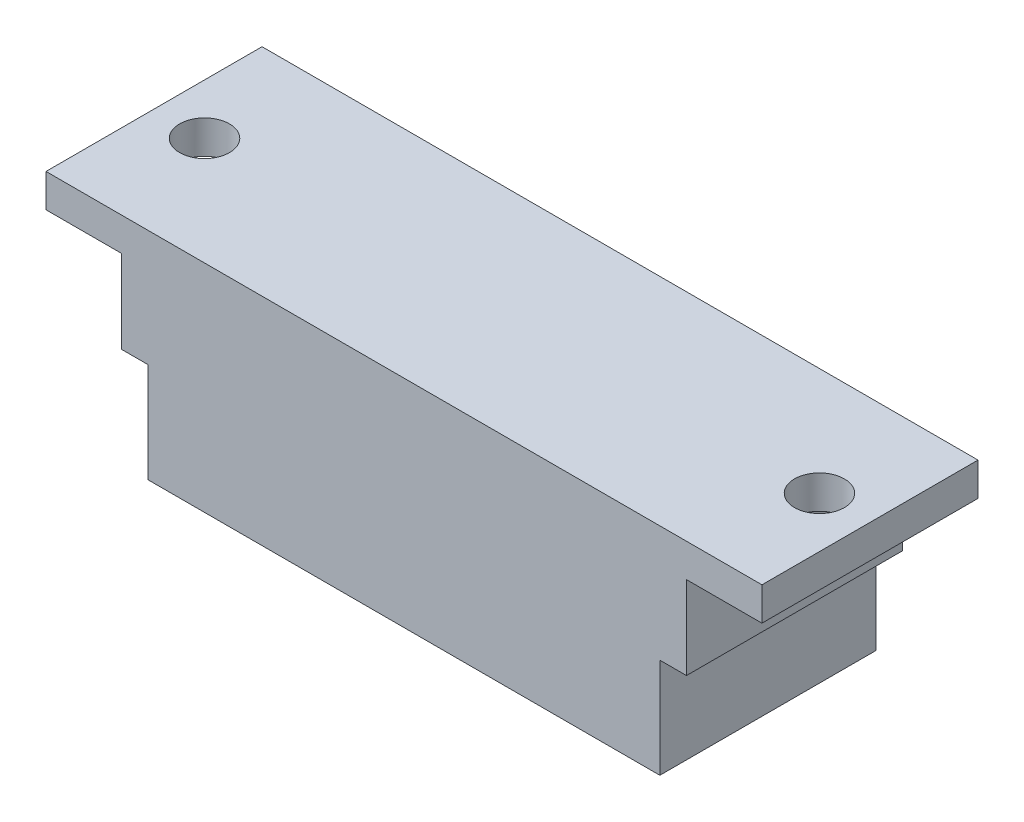
ISO-10303-21;
HEADER;
FILE_DESCRIPTION(('STEP AP214'),'2;1');
FILE_NAME('part.step','',(''),(''),'','','');
FILE_SCHEMA(('AUTOMOTIVE_DESIGN { 1 0 10303 214 1 1 1 1 }'));
ENDSEC;
DATA;
#1=APPLICATION_CONTEXT('core data for automotive mechanical design processes');
#2=APPLICATION_PROTOCOL_DEFINITION('international standard','automotive_design',2000,#1);
#3=PRODUCT_CONTEXT('',#1,'mechanical');
#4=PRODUCT('Part','Part','',(#3));
#5=PRODUCT_RELATED_PRODUCT_CATEGORY('part','',(#4));
#6=PRODUCT_DEFINITION_FORMATION('','',#4);
#7=PRODUCT_DEFINITION_CONTEXT('part definition',#1,'design');
#8=PRODUCT_DEFINITION('design','',#6,#7);
#9=PRODUCT_DEFINITION_SHAPE('','',#8);
#10=(LENGTH_UNIT() NAMED_UNIT(*) SI_UNIT(.MILLI.,.METRE.));
#11=(NAMED_UNIT(*) PLANE_ANGLE_UNIT() SI_UNIT($,.RADIAN.));
#12=(NAMED_UNIT(*) SI_UNIT($,.STERADIAN.) SOLID_ANGLE_UNIT());
#13=UNCERTAINTY_MEASURE_WITH_UNIT(LENGTH_MEASURE(1.E-05),#10,'distance_accuracy_value','');
#14=(GEOMETRIC_REPRESENTATION_CONTEXT(3) GLOBAL_UNCERTAINTY_ASSIGNED_CONTEXT((#13)) GLOBAL_UNIT_ASSIGNED_CONTEXT((#10,
#11,#12)) REPRESENTATION_CONTEXT('',''));
#15=CARTESIAN_POINT('',(0.,0.,0.));
#16=DIRECTION('',(0.,0.,1.));
#17=DIRECTION('',(1.,0.,0.));
#18=AXIS2_PLACEMENT_3D('',#15,#16,#17);
#19=CARTESIAN_POINT('',(21.5406738491967,5.29196437602219,13.));
#20=DIRECTION('',(-1.,0.,0.));
#21=DIRECTION('',(0.,0.,1.));
#22=AXIS2_PLACEMENT_3D('',#19,#20,#21);
#23=PLANE('',#22);
#24=DIRECTION('',(0.,1.,0.));
#25=VECTOR('',#24,1.);
#26=CARTESIAN_POINT('',(21.5406738491967,5.29196437602219,0.));
#27=LINE('',#26,#25);
#28=CARTESIAN_POINT('',(21.5406738491967,3.2919643760222,0.));
#29=VERTEX_POINT('',#28);
#30=CARTESIAN_POINT('',(21.5406738491967,5.29196437602219,0.));
#31=VERTEX_POINT('',#30);
#32=EDGE_CURVE('E156',#29,#31,#27,.T.);
#33=ORIENTED_EDGE('',*,*,#32,.T.);
#34=DIRECTION('',(0.,0.,-1.));
#35=VECTOR('',#34,1.);
#36=CARTESIAN_POINT('',(21.5406738491967,5.29196437602219,13.));
#37=LINE('',#36,#35);
#38=CARTESIAN_POINT('',(21.5406738491967,5.29196437602219,13.));
#39=VERTEX_POINT('',#38);
#40=EDGE_CURVE('E11',#39,#31,#37,.T.);
#41=ORIENTED_EDGE('',*,*,#40,.F.);
#42=DIRECTION('',(0.,1.,0.));
#43=VECTOR('',#42,1.);
#44=CARTESIAN_POINT('',(21.5406738491967,5.29196437602219,13.));
#45=LINE('',#44,#43);
#46=CARTESIAN_POINT('',(21.5406738491967,3.2919643760222,13.));
#47=VERTEX_POINT('',#46);
#48=EDGE_CURVE('E179',#47,#39,#45,.T.);
#49=ORIENTED_EDGE('',*,*,#48,.F.);
#50=DIRECTION('',(0.,0.,-1.));
#51=VECTOR('',#50,1.);
#52=CARTESIAN_POINT('',(21.5406738491967,3.2919643760222,13.));
#53=LINE('',#52,#51);
#54=EDGE_CURVE('E152',#47,#29,#53,.T.);
#55=ORIENTED_EDGE('',*,*,#54,.T.);
#56=EDGE_LOOP('',(#33,#41,#49,#55));
#57=FACE_BOUND('',#56,.T.);
#58=ADVANCED_FACE('F34',(#57),#23,.F.);
#59=CARTESIAN_POINT('',(-21.5406738491967,5.29196437602219,13.));
#60=DIRECTION('',(0.,-1.,0.));
#61=DIRECTION('',(0.,0.,-1.));
#62=AXIS2_PLACEMENT_3D('',#59,#60,#61);
#63=PLANE('',#62);
#64=CARTESIAN_POINT('',(18.5,5.29196437602219,6.5));
#65=DIRECTION('',(0.,1.,0.));
#66=DIRECTION('',(0.,0.,-1.));
#67=AXIS2_PLACEMENT_3D('',#64,#65,#66);
#68=CIRCLE('',#67,1.5);
#69=CARTESIAN_POINT('',(18.5,5.29196437602219,5.));
#70=VERTEX_POINT('',#69);
#71=EDGE_CURVE('E211',#70,#70,#68,.T.);
#72=ORIENTED_EDGE('',*,*,#71,.F.);
#73=EDGE_LOOP('',(#72));
#74=FACE_BOUND('',#73,.T.);
#75=CARTESIAN_POINT('',(-18.5,5.29196437602219,6.5));
#76=DIRECTION('',(0.,1.,0.));
#77=DIRECTION('',(0.,0.,1.));
#78=AXIS2_PLACEMENT_3D('',#75,#76,#77);
#79=CIRCLE('',#78,1.5);
#80=CARTESIAN_POINT('',(-18.5,5.29196437602219,8.));
#81=VERTEX_POINT('',#80);
#82=EDGE_CURVE('E203',#81,#81,#79,.T.);
#83=ORIENTED_EDGE('',*,*,#82,.F.);
#84=EDGE_LOOP('',(#83));
#85=FACE_BOUND('',#84,.T.);
#86=DIRECTION('',(-1.,0.,0.));
#87=VECTOR('',#86,1.);
#88=CARTESIAN_POINT('',(-21.5406738491967,5.29196437602219,0.));
#89=LINE('',#88,#87);
#90=CARTESIAN_POINT('',(-21.5406738491967,5.29196437602219,0.));
#91=VERTEX_POINT('',#90);
#92=EDGE_CURVE('E159',#31,#91,#89,.T.);
#93=ORIENTED_EDGE('',*,*,#92,.T.);
#94=DIRECTION('',(0.,0.,-1.));
#95=VECTOR('',#94,1.);
#96=CARTESIAN_POINT('',(-21.5406738491967,5.29196437602219,13.));
#97=LINE('',#96,#95);
#98=CARTESIAN_POINT('',(-21.5406738491967,5.29196437602219,13.));
#99=VERTEX_POINT('',#98);
#100=EDGE_CURVE('E43',#99,#91,#97,.T.);
#101=ORIENTED_EDGE('',*,*,#100,.F.);
#102=DIRECTION('',(-1.,0.,0.));
#103=VECTOR('',#102,1.);
#104=CARTESIAN_POINT('',(-21.5406738491967,5.29196437602219,13.));
#105=LINE('',#104,#103);
#106=EDGE_CURVE('E107',#39,#99,#105,.T.);
#107=ORIENTED_EDGE('',*,*,#106,.F.);
#108=ORIENTED_EDGE('',*,*,#40,.T.);
#109=EDGE_LOOP('',(#93,#101,#107,#108));
#110=FACE_BOUND('',#109,.T.);
#111=ADVANCED_FACE('F256',(#74,#85,#110),#63,.F.);
#112=CARTESIAN_POINT('',(-21.5406738491967,5.29196437602219,13.));
#113=DIRECTION('',(1.,0.,0.));
#114=DIRECTION('',(0.,0.,-1.));
#115=AXIS2_PLACEMENT_3D('',#112,#113,#114);
#116=PLANE('',#115);
#117=DIRECTION('',(0.,-1.,0.));
#118=VECTOR('',#117,1.);
#119=CARTESIAN_POINT('',(-21.5406738491967,5.29196437602219,0.));
#120=LINE('',#119,#118);
#121=CARTESIAN_POINT('',(-21.5406738491967,3.2919643760222,0.));
#122=VERTEX_POINT('',#121);
#123=EDGE_CURVE('E162',#91,#122,#120,.T.);
#124=ORIENTED_EDGE('',*,*,#123,.T.);
#125=DIRECTION('',(0.,0.,-1.));
#126=VECTOR('',#125,1.);
#127=CARTESIAN_POINT('',(-21.5406738491967,3.2919643760222,13.));
#128=LINE('',#127,#126);
#129=CARTESIAN_POINT('',(-21.5406738491967,3.2919643760222,13.));
#130=VERTEX_POINT('',#129);
#131=EDGE_CURVE('E198',#130,#122,#128,.T.);
#132=ORIENTED_EDGE('',*,*,#131,.F.);
#133=DIRECTION('',(0.,-1.,0.));
#134=VECTOR('',#133,1.);
#135=CARTESIAN_POINT('',(-21.5406738491967,5.29196437602219,13.));
#136=LINE('',#135,#134);
#137=EDGE_CURVE('E216',#99,#130,#136,.T.);
#138=ORIENTED_EDGE('',*,*,#137,.F.);
#139=ORIENTED_EDGE('',*,*,#100,.T.);
#140=EDGE_LOOP('',(#124,#132,#138,#139));
#141=FACE_BOUND('',#140,.T.);
#142=ADVANCED_FACE('F260',(#141),#116,.F.);
#143=CARTESIAN_POINT('',(-21.5406738491967,3.2919643760222,13.));
#144=DIRECTION('',(0.,1.,0.));
#145=DIRECTION('',(-1.,0.,0.));
#146=AXIS2_PLACEMENT_3D('',#143,#144,#145);
#147=PLANE('',#146);
#148=CARTESIAN_POINT('',(-18.5,3.2919643760222,6.5));
#149=DIRECTION('',(0.,1.,0.));
#150=DIRECTION('',(-1.,0.,0.));
#151=AXIS2_PLACEMENT_3D('',#148,#149,#150);
#152=CIRCLE('',#151,1.5);
#153=CARTESIAN_POINT('',(-20.,3.2919643760222,6.5));
#154=VERTEX_POINT('',#153);
#155=EDGE_CURVE('E160',#154,#154,#152,.T.);
#156=ORIENTED_EDGE('',*,*,#155,.T.);
#157=EDGE_LOOP('',(#156));
#158=FACE_BOUND('',#157,.T.);
#159=DIRECTION('',(1.,0.,0.));
#160=VECTOR('',#159,1.);
#161=CARTESIAN_POINT('',(-21.5406738491967,3.2919643760222,0.));
#162=LINE('',#161,#160);
#163=CARTESIAN_POINT('',(-16.9995779587858,3.2919643760222,0.));
#164=VERTEX_POINT('',#163);
#165=EDGE_CURVE('E164',#122,#164,#162,.T.);
#166=ORIENTED_EDGE('',*,*,#165,.T.);
#167=DIRECTION('',(0.,0.,-1.));
#168=VECTOR('',#167,1.);
#169=CARTESIAN_POINT('',(-16.9995779587858,3.2919643760222,13.));
#170=LINE('',#169,#168);
#171=CARTESIAN_POINT('',(-16.9995779587858,3.2919643760222,13.));
#172=VERTEX_POINT('',#171);
#173=EDGE_CURVE('E195',#172,#164,#170,.T.);
#174=ORIENTED_EDGE('',*,*,#173,.F.);
#175=DIRECTION('',(1.,0.,0.));
#176=VECTOR('',#175,1.);
#177=CARTESIAN_POINT('',(-21.5406738491967,3.2919643760222,13.));
#178=LINE('',#177,#176);
#179=EDGE_CURVE('E218',#130,#172,#178,.T.);
#180=ORIENTED_EDGE('',*,*,#179,.F.);
#181=ORIENTED_EDGE('',*,*,#131,.T.);
#182=EDGE_LOOP('',(#166,#174,#180,#181));
#183=FACE_BOUND('',#182,.T.);
#184=ADVANCED_FACE('F265',(#158,#183),#147,.F.);
#185=CARTESIAN_POINT('',(-16.9995779587858,3.2919643760222,13.));
#186=DIRECTION('',(1.,0.,0.));
#187=DIRECTION('',(0.,0.,-1.));
#188=AXIS2_PLACEMENT_3D('',#185,#186,#187);
#189=PLANE('',#188);
#190=DIRECTION('',(0.,-1.,0.));
#191=VECTOR('',#190,1.);
#192=CARTESIAN_POINT('',(-16.9995779587858,3.2919643760222,0.));
#193=LINE('',#192,#191);
#194=CARTESIAN_POINT('',(-16.9995779587858,-1.7080356239778,0.));
#195=VERTEX_POINT('',#194);
#196=EDGE_CURVE('E166',#164,#195,#193,.T.);
#197=ORIENTED_EDGE('',*,*,#196,.T.);
#198=DIRECTION('',(0.,0.,-1.));
#199=VECTOR('',#198,1.);
#200=CARTESIAN_POINT('',(-16.9995779587858,-1.7080356239778,13.));
#201=LINE('',#200,#199);
#202=CARTESIAN_POINT('',(-16.9995779587858,-1.7080356239778,13.));
#203=VERTEX_POINT('',#202);
#204=EDGE_CURVE('E192',#203,#195,#201,.T.);
#205=ORIENTED_EDGE('',*,*,#204,.F.);
#206=DIRECTION('',(0.,-1.,0.));
#207=VECTOR('',#206,1.);
#208=CARTESIAN_POINT('',(-16.9995779587858,3.2919643760222,13.));
#209=LINE('',#208,#207);
#210=EDGE_CURVE('E220',#172,#203,#209,.T.);
#211=ORIENTED_EDGE('',*,*,#210,.F.);
#212=ORIENTED_EDGE('',*,*,#173,.T.);
#213=EDGE_LOOP('',(#197,#205,#211,#212));
#214=FACE_BOUND('',#213,.T.);
#215=ADVANCED_FACE('F273',(#214),#189,.F.);
#216=CARTESIAN_POINT('',(-16.9995779587858,-1.7080356239778,13.));
#217=DIRECTION('',(0.,1.,0.));
#218=DIRECTION('',(-1.,0.,0.));
#219=AXIS2_PLACEMENT_3D('',#216,#217,#218);
#220=PLANE('',#219);
#221=DIRECTION('',(1.,0.,0.));
#222=VECTOR('',#221,1.);
#223=CARTESIAN_POINT('',(-16.9995779587858,-1.7080356239778,0.));
#224=LINE('',#223,#222);
#225=CARTESIAN_POINT('',(-15.3968382327583,-1.7080356239778,0.));
#226=VERTEX_POINT('',#225);
#227=EDGE_CURVE('E168',#195,#226,#224,.T.);
#228=ORIENTED_EDGE('',*,*,#227,.T.);
#229=DIRECTION('',(0.,0.,-1.));
#230=VECTOR('',#229,1.);
#231=CARTESIAN_POINT('',(-15.3968382327583,-1.7080356239778,13.));
#232=LINE('',#231,#230);
#233=CARTESIAN_POINT('',(-15.3968382327583,-1.7080356239778,13.));
#234=VERTEX_POINT('',#233);
#235=EDGE_CURVE('E189',#234,#226,#232,.T.);
#236=ORIENTED_EDGE('',*,*,#235,.F.);
#237=DIRECTION('',(1.,0.,0.));
#238=VECTOR('',#237,1.);
#239=CARTESIAN_POINT('',(-16.9995779587858,-1.7080356239778,13.));
#240=LINE('',#239,#238);
#241=EDGE_CURVE('E222',#203,#234,#240,.T.);
#242=ORIENTED_EDGE('',*,*,#241,.F.);
#243=ORIENTED_EDGE('',*,*,#204,.T.);
#244=EDGE_LOOP('',(#228,#236,#242,#243));
#245=FACE_BOUND('',#244,.T.);
#246=ADVANCED_FACE('F276',(#245),#220,.F.);
#247=CARTESIAN_POINT('',(-15.3968382327583,-1.7080356239778,13.));
#248=DIRECTION('',(1.,0.,0.));
#249=DIRECTION('',(0.,0.,-1.));
#250=AXIS2_PLACEMENT_3D('',#247,#248,#249);
#251=PLANE('',#250);
#252=DIRECTION('',(0.,-1.,0.));
#253=VECTOR('',#252,1.);
#254=CARTESIAN_POINT('',(-15.3968382327583,-1.7080356239778,0.));
#255=LINE('',#254,#253);
#256=CARTESIAN_POINT('',(-15.3968382327583,-7.70803562397781,0.));
#257=VERTEX_POINT('',#256);
#258=EDGE_CURVE('E170',#226,#257,#255,.T.);
#259=ORIENTED_EDGE('',*,*,#258,.T.);
#260=DIRECTION('',(0.,0.,-1.));
#261=VECTOR('',#260,1.);
#262=CARTESIAN_POINT('',(-15.3968382327583,-7.70803562397781,13.));
#263=LINE('',#262,#261);
#264=CARTESIAN_POINT('',(-15.3968382327583,-7.70803562397781,13.));
#265=VERTEX_POINT('',#264);
#266=EDGE_CURVE('E186',#265,#257,#263,.T.);
#267=ORIENTED_EDGE('',*,*,#266,.F.);
#268=DIRECTION('',(0.,-1.,0.));
#269=VECTOR('',#268,1.);
#270=CARTESIAN_POINT('',(-15.3968382327583,-1.7080356239778,13.));
#271=LINE('',#270,#269);
#272=EDGE_CURVE('E224',#234,#265,#271,.T.);
#273=ORIENTED_EDGE('',*,*,#272,.F.);
#274=ORIENTED_EDGE('',*,*,#235,.T.);
#275=EDGE_LOOP('',(#259,#267,#273,#274));
#276=FACE_BOUND('',#275,.T.);
#277=ADVANCED_FACE('F280',(#276),#251,.F.);
#278=CARTESIAN_POINT('',(15.3968382327583,-7.70803562397781,13.));
#279=DIRECTION('',(0.,1.,0.));
#280=DIRECTION('',(0.,0.,1.));
#281=AXIS2_PLACEMENT_3D('',#278,#279,#280);
#282=PLANE('',#281);
#283=DIRECTION('',(1.,0.,0.));
#284=VECTOR('',#283,1.);
#285=CARTESIAN_POINT('',(15.3968382327583,-7.70803562397781,0.));
#286=LINE('',#285,#284);
#287=CARTESIAN_POINT('',(15.3968382327583,-7.70803562397781,0.));
#288=VERTEX_POINT('',#287);
#289=EDGE_CURVE('E172',#257,#288,#286,.T.);
#290=ORIENTED_EDGE('',*,*,#289,.T.);
#291=DIRECTION('',(0.,0.,-1.));
#292=VECTOR('',#291,1.);
#293=CARTESIAN_POINT('',(15.3968382327583,-7.70803562397781,13.));
#294=LINE('',#293,#292);
#295=CARTESIAN_POINT('',(15.3968382327583,-7.70803562397781,13.));
#296=VERTEX_POINT('',#295);
#297=EDGE_CURVE('E183',#296,#288,#294,.T.);
#298=ORIENTED_EDGE('',*,*,#297,.F.);
#299=DIRECTION('',(1.,0.,0.));
#300=VECTOR('',#299,1.);
#301=CARTESIAN_POINT('',(15.3968382327583,-7.70803562397781,13.));
#302=LINE('',#301,#300);
#303=EDGE_CURVE('E226',#265,#296,#302,.T.);
#304=ORIENTED_EDGE('',*,*,#303,.F.);
#305=ORIENTED_EDGE('',*,*,#266,.T.);
#306=EDGE_LOOP('',(#290,#298,#304,#305));
#307=FACE_BOUND('',#306,.T.);
#308=ADVANCED_FACE('F232',(#307),#282,.F.);
#309=CARTESIAN_POINT('',(15.3968382327583,-1.7080356239778,13.));
#310=DIRECTION('',(-1.,0.,0.));
#311=DIRECTION('',(0.,0.,1.));
#312=AXIS2_PLACEMENT_3D('',#309,#310,#311);
#313=PLANE('',#312);
#314=DIRECTION('',(0.,1.,0.));
#315=VECTOR('',#314,1.);
#316=CARTESIAN_POINT('',(15.3968382327583,-1.7080356239778,0.));
#317=LINE('',#316,#315);
#318=CARTESIAN_POINT('',(15.3968382327583,-1.7080356239778,0.));
#319=VERTEX_POINT('',#318);
#320=EDGE_CURVE('E174',#288,#319,#317,.T.);
#321=ORIENTED_EDGE('',*,*,#320,.T.);
#322=DIRECTION('',(0.,0.,-1.));
#323=VECTOR('',#322,1.);
#324=CARTESIAN_POINT('',(15.3968382327583,-1.7080356239778,13.));
#325=LINE('',#324,#323);
#326=CARTESIAN_POINT('',(15.3968382327583,-1.7080356239778,13.));
#327=VERTEX_POINT('',#326);
#328=EDGE_CURVE('E147',#327,#319,#325,.T.);
#329=ORIENTED_EDGE('',*,*,#328,.F.);
#330=DIRECTION('',(0.,1.,0.));
#331=VECTOR('',#330,1.);
#332=CARTESIAN_POINT('',(15.3968382327583,-1.7080356239778,13.));
#333=LINE('',#332,#331);
#334=EDGE_CURVE('E138',#296,#327,#333,.T.);
#335=ORIENTED_EDGE('',*,*,#334,.F.);
#336=ORIENTED_EDGE('',*,*,#297,.T.);
#337=EDGE_LOOP('',(#321,#329,#335,#336));
#338=FACE_BOUND('',#337,.T.);
#339=ADVANCED_FACE('F236',(#338),#313,.F.);
#340=CARTESIAN_POINT('',(16.9995779587858,-1.7080356239778,13.));
#341=DIRECTION('',(0.,1.,0.));
#342=DIRECTION('',(-1.,0.,0.));
#343=AXIS2_PLACEMENT_3D('',#340,#341,#342);
#344=PLANE('',#343);
#345=DIRECTION('',(1.,0.,0.));
#346=VECTOR('',#345,1.);
#347=CARTESIAN_POINT('',(16.9995779587858,-1.7080356239778,0.));
#348=LINE('',#347,#346);
#349=CARTESIAN_POINT('',(16.9995779587858,-1.7080356239778,0.));
#350=VERTEX_POINT('',#349);
#351=EDGE_CURVE('E146',#319,#350,#348,.T.);
#352=ORIENTED_EDGE('',*,*,#351,.T.);
#353=DIRECTION('',(0.,0.,-1.));
#354=VECTOR('',#353,1.);
#355=CARTESIAN_POINT('',(16.9995779587858,-1.7080356239778,13.));
#356=LINE('',#355,#354);
#357=CARTESIAN_POINT('',(16.9995779587858,-1.7080356239778,13.));
#358=VERTEX_POINT('',#357);
#359=EDGE_CURVE('E143',#358,#350,#356,.T.);
#360=ORIENTED_EDGE('',*,*,#359,.F.);
#361=DIRECTION('',(1.,0.,0.));
#362=VECTOR('',#361,1.);
#363=CARTESIAN_POINT('',(16.9995779587858,-1.7080356239778,13.));
#364=LINE('',#363,#362);
#365=EDGE_CURVE('E132',#327,#358,#364,.T.);
#366=ORIENTED_EDGE('',*,*,#365,.F.);
#367=ORIENTED_EDGE('',*,*,#328,.T.);
#368=EDGE_LOOP('',(#352,#360,#366,#367));
#369=FACE_BOUND('',#368,.T.);
#370=ADVANCED_FACE('F144',(#369),#344,.F.);
#371=CARTESIAN_POINT('',(16.9995779587858,3.2919643760222,13.));
#372=DIRECTION('',(-1.,0.,0.));
#373=DIRECTION('',(0.,0.,1.));
#374=AXIS2_PLACEMENT_3D('',#371,#372,#373);
#375=PLANE('',#374);
#376=DIRECTION('',(0.,1.,0.));
#377=VECTOR('',#376,1.);
#378=CARTESIAN_POINT('',(16.9995779587858,3.2919643760222,0.));
#379=LINE('',#378,#377);
#380=CARTESIAN_POINT('',(16.9995779587858,3.2919643760222,0.));
#381=VERTEX_POINT('',#380);
#382=EDGE_CURVE('E93',#350,#381,#379,.T.);
#383=ORIENTED_EDGE('',*,*,#382,.T.);
#384=DIRECTION('',(0.,0.,-1.));
#385=VECTOR('',#384,1.);
#386=CARTESIAN_POINT('',(16.9995779587858,3.2919643760222,13.));
#387=LINE('',#386,#385);
#388=CARTESIAN_POINT('',(16.9995779587858,3.2919643760222,13.));
#389=VERTEX_POINT('',#388);
#390=EDGE_CURVE('E148',#389,#381,#387,.T.);
#391=ORIENTED_EDGE('',*,*,#390,.F.);
#392=DIRECTION('',(0.,1.,0.));
#393=VECTOR('',#392,1.);
#394=CARTESIAN_POINT('',(16.9995779587858,3.2919643760222,13.));
#395=LINE('',#394,#393);
#396=EDGE_CURVE('E136',#358,#389,#395,.T.);
#397=ORIENTED_EDGE('',*,*,#396,.F.);
#398=ORIENTED_EDGE('',*,*,#359,.T.);
#399=EDGE_LOOP('',(#383,#391,#397,#398));
#400=FACE_BOUND('',#399,.T.);
#401=ADVANCED_FACE('F150',(#400),#375,.F.);
#402=CARTESIAN_POINT('',(21.5406738491967,3.2919643760222,13.));
#403=DIRECTION('',(0.,1.,0.));
#404=DIRECTION('',(-1.,0.,0.));
#405=AXIS2_PLACEMENT_3D('',#402,#403,#404);
#406=PLANE('',#405);
#407=CARTESIAN_POINT('',(18.5,3.2919643760222,6.5));
#408=DIRECTION('',(0.,1.,0.));
#409=DIRECTION('',(-1.,0.,0.));
#410=AXIS2_PLACEMENT_3D('',#407,#408,#409);
#411=CIRCLE('',#410,1.5);
#412=CARTESIAN_POINT('',(17.,3.2919643760222,6.5));
#413=VERTEX_POINT('',#412);
#414=EDGE_CURVE('E37',#413,#413,#411,.T.);
#415=ORIENTED_EDGE('',*,*,#414,.T.);
#416=EDGE_LOOP('',(#415));
#417=FACE_BOUND('',#416,.T.);
#418=DIRECTION('',(1.,0.,0.));
#419=VECTOR('',#418,1.);
#420=CARTESIAN_POINT('',(21.5406738491967,3.2919643760222,0.));
#421=LINE('',#420,#419);
#422=EDGE_CURVE('E99',#381,#29,#421,.T.);
#423=ORIENTED_EDGE('',*,*,#422,.T.);
#424=ORIENTED_EDGE('',*,*,#54,.F.);
#425=DIRECTION('',(1.,0.,0.));
#426=VECTOR('',#425,1.);
#427=CARTESIAN_POINT('',(21.5406738491967,3.2919643760222,13.));
#428=LINE('',#427,#426);
#429=EDGE_CURVE('E52',#389,#47,#428,.T.);
#430=ORIENTED_EDGE('',*,*,#429,.F.);
#431=ORIENTED_EDGE('',*,*,#390,.T.);
#432=EDGE_LOOP('',(#423,#424,#430,#431));
#433=FACE_BOUND('',#432,.T.);
#434=ADVANCED_FACE('F244',(#417,#433),#406,.F.);
#435=CARTESIAN_POINT('',(0.,0.,13.));
#436=DIRECTION('',(0.,0.,-1.));
#437=DIRECTION('',(-1.,0.,0.));
#438=AXIS2_PLACEMENT_3D('',#435,#436,#437);
#439=PLANE('',#438);
#440=ORIENTED_EDGE('',*,*,#48,.T.);
#441=ORIENTED_EDGE('',*,*,#106,.T.);
#442=ORIENTED_EDGE('',*,*,#137,.T.);
#443=ORIENTED_EDGE('',*,*,#179,.T.);
#444=ORIENTED_EDGE('',*,*,#210,.T.);
#445=ORIENTED_EDGE('',*,*,#241,.T.);
#446=ORIENTED_EDGE('',*,*,#272,.T.);
#447=ORIENTED_EDGE('',*,*,#303,.T.);
#448=ORIENTED_EDGE('',*,*,#334,.T.);
#449=ORIENTED_EDGE('',*,*,#365,.T.);
#450=ORIENTED_EDGE('',*,*,#396,.T.);
#451=ORIENTED_EDGE('',*,*,#429,.T.);
#452=EDGE_LOOP('',(#440,#441,#442,#443,#444,#445,#446,#447,#448,#449,#450,#451));
#453=FACE_BOUND('',#452,.T.);
#454=ADVANCED_FACE('F134',(#453),#439,.F.);
#455=CARTESIAN_POINT('',(0.,0.,0.));
#456=DIRECTION('',(0.,0.,-1.));
#457=DIRECTION('',(-1.,0.,0.));
#458=AXIS2_PLACEMENT_3D('',#455,#456,#457);
#459=PLANE('',#458);
#460=ORIENTED_EDGE('',*,*,#32,.F.);
#461=ORIENTED_EDGE('',*,*,#422,.F.);
#462=ORIENTED_EDGE('',*,*,#382,.F.);
#463=ORIENTED_EDGE('',*,*,#351,.F.);
#464=ORIENTED_EDGE('',*,*,#320,.F.);
#465=ORIENTED_EDGE('',*,*,#289,.F.);
#466=ORIENTED_EDGE('',*,*,#258,.F.);
#467=ORIENTED_EDGE('',*,*,#227,.F.);
#468=ORIENTED_EDGE('',*,*,#196,.F.);
#469=ORIENTED_EDGE('',*,*,#165,.F.);
#470=ORIENTED_EDGE('',*,*,#123,.F.);
#471=ORIENTED_EDGE('',*,*,#92,.F.);
#472=EDGE_LOOP('',(#460,#461,#462,#463,#464,#465,#466,#467,#468,#469,#470,#471));
#473=FACE_BOUND('',#472,.T.);
#474=ADVANCED_FACE('F239',(#473),#459,.T.);
#475=CARTESIAN_POINT('',(-18.5,-7.70803562397781,6.5));
#476=DIRECTION('',(0.,1.,0.));
#477=DIRECTION('',(0.,0.,1.));
#478=AXIS2_PLACEMENT_3D('',#475,#476,#477);
#479=CYLINDRICAL_SURFACE('',#478,1.5);
#480=ORIENTED_EDGE('',*,*,#82,.T.);
#481=EDGE_LOOP('',(#480));
#482=FACE_BOUND('',#481,.T.);
#483=ORIENTED_EDGE('',*,*,#155,.F.);
#484=EDGE_LOOP('',(#483));
#485=FACE_BOUND('',#484,.T.);
#486=ADVANCED_FACE('F313',(#482,#485),#479,.F.);
#487=CARTESIAN_POINT('',(18.5,-7.70803562397781,6.5));
#488=DIRECTION('',(0.,1.,0.));
#489=DIRECTION('',(0.,0.,1.));
#490=AXIS2_PLACEMENT_3D('',#487,#488,#489);
#491=CYLINDRICAL_SURFACE('',#490,1.5);
#492=ORIENTED_EDGE('',*,*,#71,.T.);
#493=EDGE_LOOP('',(#492));
#494=FACE_BOUND('',#493,.T.);
#495=ORIENTED_EDGE('',*,*,#414,.F.);
#496=EDGE_LOOP('',(#495));
#497=FACE_BOUND('',#496,.T.);
#498=ADVANCED_FACE('F338',(#494,#497),#491,.F.);
#499=CLOSED_SHELL('',(#58,#111,#142,#184,#215,#246,#277,#308,#339,#370,#401,#434,#454,#474,#486,#498));
#500=MANIFOLD_SOLID_BREP('B2',#499);
#501=ADVANCED_BREP_SHAPE_REPRESENTATION('',(#18,#500),#14);
#502=SHAPE_DEFINITION_REPRESENTATION(#9,#501);
ENDSEC;
END-ISO-10303-21;
